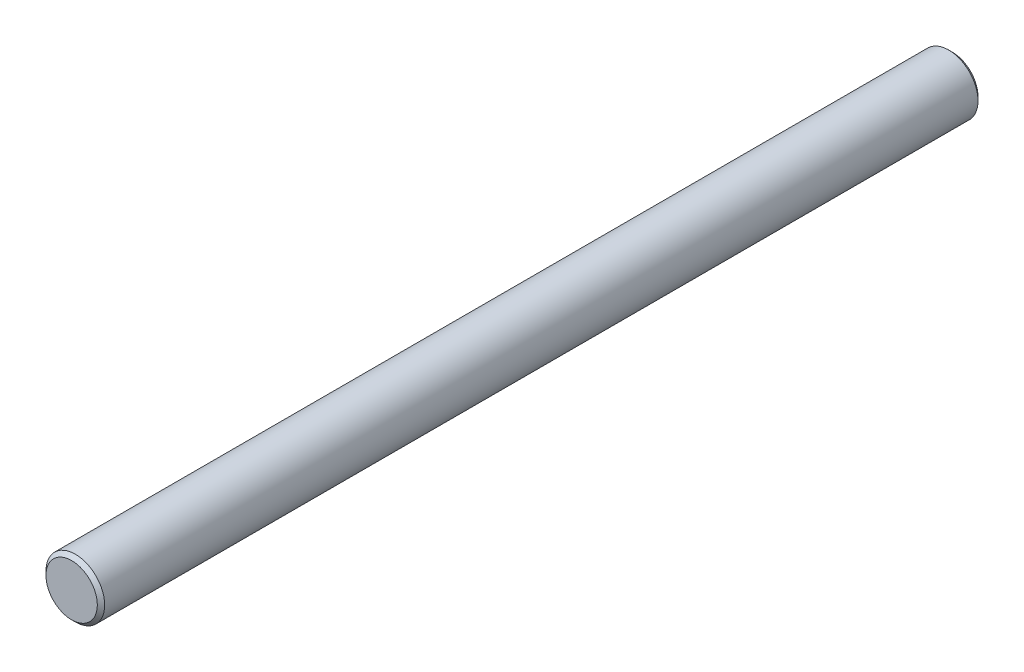
ISO-10303-21;
HEADER;
FILE_DESCRIPTION(('STEP AP214'),'2;1');
FILE_NAME('part.step','',(''),(''),'','','');
FILE_SCHEMA(('AUTOMOTIVE_DESIGN { 1 0 10303 214 1 1 1 1 }'));
ENDSEC;
DATA;
#1=APPLICATION_CONTEXT('core data for automotive mechanical design processes');
#2=APPLICATION_PROTOCOL_DEFINITION('international standard','automotive_design',2000,#1);
#3=PRODUCT_CONTEXT('',#1,'mechanical');
#4=PRODUCT('Part','Part','',(#3));
#5=PRODUCT_RELATED_PRODUCT_CATEGORY('part','',(#4));
#6=PRODUCT_DEFINITION_FORMATION('','',#4);
#7=PRODUCT_DEFINITION_CONTEXT('part definition',#1,'design');
#8=PRODUCT_DEFINITION('design','',#6,#7);
#9=PRODUCT_DEFINITION_SHAPE('','',#8);
#10=(LENGTH_UNIT() NAMED_UNIT(*) SI_UNIT(.MILLI.,.METRE.));
#11=(NAMED_UNIT(*) PLANE_ANGLE_UNIT() SI_UNIT($,.RADIAN.));
#12=(NAMED_UNIT(*) SI_UNIT($,.STERADIAN.) SOLID_ANGLE_UNIT());
#13=UNCERTAINTY_MEASURE_WITH_UNIT(LENGTH_MEASURE(1.E-05),#10,'distance_accuracy_value','');
#14=(GEOMETRIC_REPRESENTATION_CONTEXT(3) GLOBAL_UNCERTAINTY_ASSIGNED_CONTEXT((#13)) GLOBAL_UNIT_ASSIGNED_CONTEXT((#10,
#11,#12)) REPRESENTATION_CONTEXT('',''));
#15=CARTESIAN_POINT('',(0.,0.,0.));
#16=DIRECTION('',(0.,0.,1.));
#17=DIRECTION('',(1.,0.,0.));
#18=AXIS2_PLACEMENT_3D('',#15,#16,#17);
#19=CARTESIAN_POINT('',(0.,0.,120.));
#20=DIRECTION('',(0.,0.,-1.));
#21=DIRECTION('',(-1.,0.,0.));
#22=AXIS2_PLACEMENT_3D('',#19,#20,#21);
#23=CYLINDRICAL_SURFACE('',#22,4.);
#24=CARTESIAN_POINT('',(0.,0.,119.5));
#25=DIRECTION('',(0.,0.,1.));
#26=DIRECTION('',(1.,0.,0.));
#27=AXIS2_PLACEMENT_3D('',#24,#25,#26);
#28=CIRCLE('',#27,4.);
#29=CARTESIAN_POINT('',(4.,0.,119.5));
#30=VERTEX_POINT('',#29);
#31=EDGE_CURVE('E39',#30,#30,#28,.F.);
#32=ORIENTED_EDGE('',*,*,#31,.T.);
#33=EDGE_LOOP('',(#32));
#34=FACE_BOUND('',#33,.T.);
#35=CARTESIAN_POINT('',(0.,0.,0.499999999999987));
#36=DIRECTION('',(0.,0.,1.));
#37=DIRECTION('',(1.,0.,0.));
#38=AXIS2_PLACEMENT_3D('',#35,#36,#37);
#39=CIRCLE('',#38,4.);
#40=CARTESIAN_POINT('',(4.,0.,0.499999999999987));
#41=VERTEX_POINT('',#40);
#42=EDGE_CURVE('E43',#41,#41,#39,.T.);
#43=ORIENTED_EDGE('',*,*,#42,.T.);
#44=EDGE_LOOP('',(#43));
#45=FACE_BOUND('',#44,.T.);
#46=ADVANCED_FACE('F32',(#34,#45),#23,.T.);
#47=CARTESIAN_POINT('',(0.,0.,120.));
#48=DIRECTION('',(0.,0.,1.));
#49=DIRECTION('',(1.,0.,0.));
#50=AXIS2_PLACEMENT_3D('',#47,#48,#49);
#51=PLANE('',#50);
#52=CARTESIAN_POINT('',(0.,0.,120.));
#53=DIRECTION('',(0.,0.,1.));
#54=DIRECTION('',(1.,0.,0.));
#55=AXIS2_PLACEMENT_3D('',#52,#53,#54);
#56=CIRCLE('',#55,3.50000000000002);
#57=CARTESIAN_POINT('',(3.50000000000002,0.,120.));
#58=VERTEX_POINT('',#57);
#59=EDGE_CURVE('E47',#58,#58,#56,.T.);
#60=ORIENTED_EDGE('',*,*,#59,.T.);
#61=EDGE_LOOP('',(#60));
#62=FACE_BOUND('',#61,.T.);
#63=ADVANCED_FACE('F53',(#62),#51,.T.);
#64=CARTESIAN_POINT('',(0.,0.,0.));
#65=DIRECTION('',(0.,0.,1.));
#66=DIRECTION('',(1.,0.,0.));
#67=AXIS2_PLACEMENT_3D('',#64,#65,#66);
#68=PLANE('',#67);
#69=CARTESIAN_POINT('',(0.,0.,0.));
#70=DIRECTION('',(0.,0.,1.));
#71=DIRECTION('',(1.,0.,0.));
#72=AXIS2_PLACEMENT_3D('',#69,#70,#71);
#73=CIRCLE('',#72,3.50000000000002);
#74=CARTESIAN_POINT('',(3.50000000000002,0.,0.));
#75=VERTEX_POINT('',#74);
#76=EDGE_CURVE('E10',#75,#75,#73,.F.);
#77=ORIENTED_EDGE('',*,*,#76,.T.);
#78=EDGE_LOOP('',(#77));
#79=FACE_BOUND('',#78,.T.);
#80=ADVANCED_FACE('F57',(#79),#68,.F.);
#81=CARTESIAN_POINT('',(0.,0.,120.));
#82=DIRECTION('',(0.,0.,-1.));
#83=DIRECTION('',(-1.,0.,0.));
#84=AXIS2_PLACEMENT_3D('',#81,#82,#83);
#85=CONICAL_SURFACE('',#84,3.50000000000002,0.785398163397445);
#86=ORIENTED_EDGE('',*,*,#31,.F.);
#87=EDGE_LOOP('',(#86));
#88=FACE_BOUND('',#87,.T.);
#89=ORIENTED_EDGE('',*,*,#59,.F.);
#90=EDGE_LOOP('',(#89));
#91=FACE_BOUND('',#90,.T.);
#92=ADVANCED_FACE('F55',(#88,#91),#85,.T.);
#93=CARTESIAN_POINT('',(0.,0.,0.499999999999987));
#94=DIRECTION('',(0.,0.,1.));
#95=DIRECTION('',(1.,0.,0.));
#96=AXIS2_PLACEMENT_3D('',#93,#94,#95);
#97=CONICAL_SURFACE('',#96,4.,0.785398163397445);
#98=ORIENTED_EDGE('',*,*,#76,.F.);
#99=EDGE_LOOP('',(#98));
#100=FACE_BOUND('',#99,.T.);
#101=ORIENTED_EDGE('',*,*,#42,.F.);
#102=EDGE_LOOP('',(#101));
#103=FACE_BOUND('',#102,.T.);
#104=ADVANCED_FACE('F34',(#100,#103),#97,.T.);
#105=CLOSED_SHELL('',(#46,#63,#80,#92,#104));
#106=MANIFOLD_SOLID_BREP('B2',#105);
#107=ADVANCED_BREP_SHAPE_REPRESENTATION('',(#18,#106),#14);
#108=SHAPE_DEFINITION_REPRESENTATION(#9,#107);
ENDSEC;
END-ISO-10303-21;
